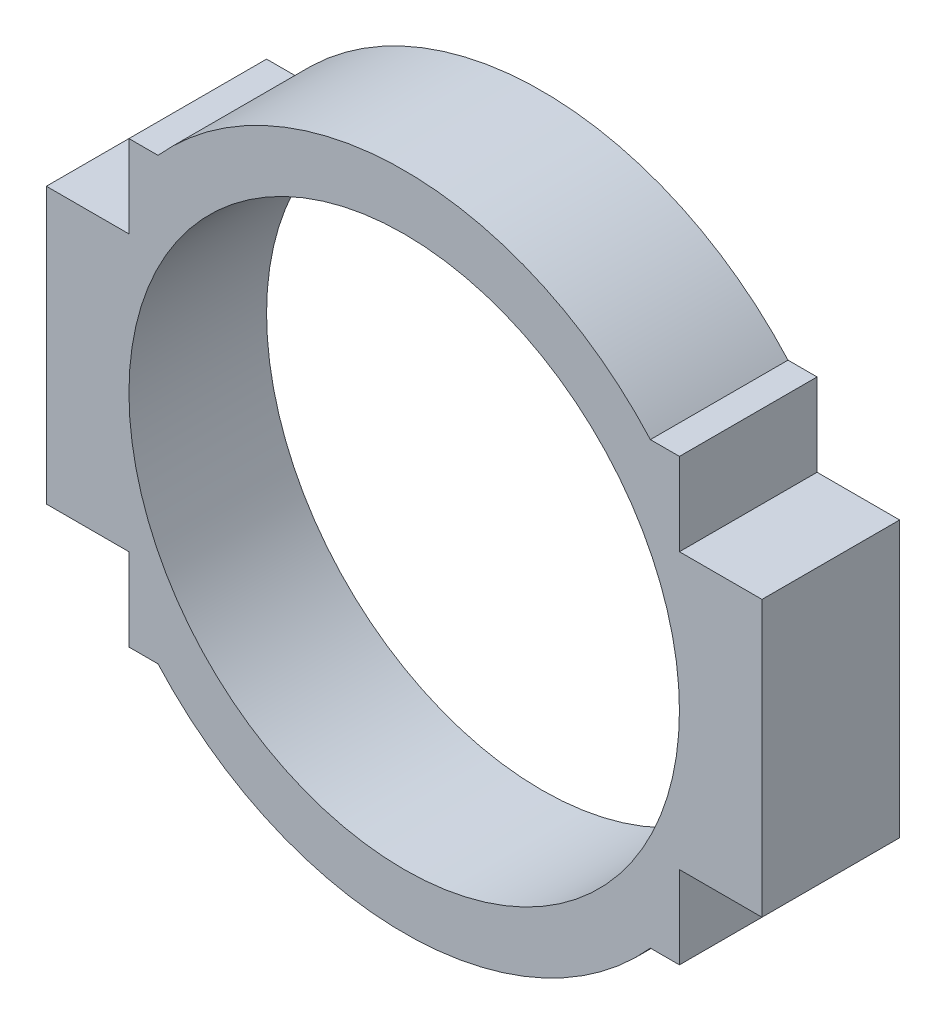
ISO-10303-21;
HEADER;
FILE_DESCRIPTION(('STEP AP214'),'2;1');
FILE_NAME('part.step','',(''),(''),'','','');
FILE_SCHEMA(('AUTOMOTIVE_DESIGN { 1 0 10303 214 1 1 1 1 }'));
ENDSEC;
DATA;
#1=APPLICATION_CONTEXT('core data for automotive mechanical design processes');
#2=APPLICATION_PROTOCOL_DEFINITION('international standard','automotive_design',2000,#1);
#3=PRODUCT_CONTEXT('',#1,'mechanical');
#4=PRODUCT('Part','Part','',(#3));
#5=PRODUCT_RELATED_PRODUCT_CATEGORY('part','',(#4));
#6=PRODUCT_DEFINITION_FORMATION('','',#4);
#7=PRODUCT_DEFINITION_CONTEXT('part definition',#1,'design');
#8=PRODUCT_DEFINITION('design','',#6,#7);
#9=PRODUCT_DEFINITION_SHAPE('','',#8);
#10=(LENGTH_UNIT() NAMED_UNIT(*) SI_UNIT(.MILLI.,.METRE.));
#11=(NAMED_UNIT(*) PLANE_ANGLE_UNIT() SI_UNIT($,.RADIAN.));
#12=(NAMED_UNIT(*) SI_UNIT($,.STERADIAN.) SOLID_ANGLE_UNIT());
#13=UNCERTAINTY_MEASURE_WITH_UNIT(LENGTH_MEASURE(1.E-05),#10,'distance_accuracy_value','');
#14=(GEOMETRIC_REPRESENTATION_CONTEXT(3) GLOBAL_UNCERTAINTY_ASSIGNED_CONTEXT((#13)) GLOBAL_UNIT_ASSIGNED_CONTEXT((#10,
#11,#12)) REPRESENTATION_CONTEXT('',''));
#15=CARTESIAN_POINT('',(0.,0.,0.));
#16=DIRECTION('',(0.,0.,1.));
#17=DIRECTION('',(1.,0.,0.));
#18=AXIS2_PLACEMENT_3D('',#15,#16,#17);
#19=CARTESIAN_POINT('',(0.,0.,5.));
#20=DIRECTION('',(0.,0.,1.));
#21=DIRECTION('',(1.,0.,0.));
#22=AXIS2_PLACEMENT_3D('',#19,#20,#21);
#23=PLANE('',#22);
#24=CARTESIAN_POINT('',(0.,0.,5.));
#25=DIRECTION('',(0.,0.,1.));
#26=DIRECTION('',(1.,0.,0.));
#27=AXIS2_PLACEMENT_3D('',#24,#25,#26);
#28=CIRCLE('',#27,12.);
#29=CARTESIAN_POINT('',(-8.94427190999916,-8.,5.));
#30=VERTEX_POINT('',#29);
#31=CARTESIAN_POINT('',(8.94427190999916,-8.,5.));
#32=VERTEX_POINT('',#31);
#33=EDGE_CURVE('E209',#30,#32,#28,.T.);
#34=ORIENTED_EDGE('',*,*,#33,.T.);
#35=DIRECTION('',(1.,0.,0.));
#36=VECTOR('',#35,1.);
#37=CARTESIAN_POINT('',(10.,-8.,5.));
#38=LINE('',#37,#36);
#39=CARTESIAN_POINT('',(10.,-8.,5.));
#40=VERTEX_POINT('',#39);
#41=EDGE_CURVE('E117',#32,#40,#38,.T.);
#42=ORIENTED_EDGE('',*,*,#41,.T.);
#43=DIRECTION('',(0.,1.,0.));
#44=VECTOR('',#43,1.);
#45=CARTESIAN_POINT('',(10.,-5.,5.));
#46=LINE('',#45,#44);
#47=CARTESIAN_POINT('',(10.,-5.,5.));
#48=VERTEX_POINT('',#47);
#49=EDGE_CURVE('E248',#40,#48,#46,.T.);
#50=ORIENTED_EDGE('',*,*,#49,.T.);
#51=DIRECTION('',(1.,0.,0.));
#52=VECTOR('',#51,1.);
#53=CARTESIAN_POINT('',(13.,-5.,5.));
#54=LINE('',#53,#52);
#55=CARTESIAN_POINT('',(13.,-5.,5.));
#56=VERTEX_POINT('',#55);
#57=EDGE_CURVE('E267',#48,#56,#54,.T.);
#58=ORIENTED_EDGE('',*,*,#57,.T.);
#59=DIRECTION('',(0.,1.,0.));
#60=VECTOR('',#59,1.);
#61=CARTESIAN_POINT('',(13.,-5.,5.));
#62=LINE('',#61,#60);
#63=CARTESIAN_POINT('',(13.,5.,5.));
#64=VERTEX_POINT('',#63);
#65=EDGE_CURVE('E264',#56,#64,#62,.T.);
#66=ORIENTED_EDGE('',*,*,#65,.T.);
#67=DIRECTION('',(-1.,0.,0.));
#68=VECTOR('',#67,1.);
#69=CARTESIAN_POINT('',(13.,5.,5.));
#70=LINE('',#69,#68);
#71=CARTESIAN_POINT('',(10.,5.,5.));
#72=VERTEX_POINT('',#71);
#73=EDGE_CURVE('E266',#64,#72,#70,.T.);
#74=ORIENTED_EDGE('',*,*,#73,.T.);
#75=DIRECTION('',(0.,1.,0.));
#76=VECTOR('',#75,1.);
#77=CARTESIAN_POINT('',(10.,5.,5.));
#78=LINE('',#77,#76);
#79=CARTESIAN_POINT('',(10.,8.,5.));
#80=VERTEX_POINT('',#79);
#81=EDGE_CURVE('E269',#72,#80,#78,.T.);
#82=ORIENTED_EDGE('',*,*,#81,.T.);
#83=DIRECTION('',(-1.,0.,0.));
#84=VECTOR('',#83,1.);
#85=CARTESIAN_POINT('',(10.,8.,5.));
#86=LINE('',#85,#84);
#87=CARTESIAN_POINT('',(8.94427190999916,8.,5.));
#88=VERTEX_POINT('',#87);
#89=EDGE_CURVE('E275',#80,#88,#86,.T.);
#90=ORIENTED_EDGE('',*,*,#89,.T.);
#91=CARTESIAN_POINT('',(0.,0.,5.));
#92=DIRECTION('',(0.,0.,1.));
#93=DIRECTION('',(-1.,0.,0.));
#94=AXIS2_PLACEMENT_3D('',#91,#92,#93);
#95=CIRCLE('',#94,12.);
#96=CARTESIAN_POINT('',(-8.94427190999916,8.,5.));
#97=VERTEX_POINT('',#96);
#98=EDGE_CURVE('E277',#88,#97,#95,.T.);
#99=ORIENTED_EDGE('',*,*,#98,.T.);
#100=DIRECTION('',(-1.,0.,0.));
#101=VECTOR('',#100,1.);
#102=CARTESIAN_POINT('',(-10.,8.,5.));
#103=LINE('',#102,#101);
#104=CARTESIAN_POINT('',(-10.,8.,5.));
#105=VERTEX_POINT('',#104);
#106=EDGE_CURVE('E279',#97,#105,#103,.T.);
#107=ORIENTED_EDGE('',*,*,#106,.T.);
#108=DIRECTION('',(0.,-1.,0.));
#109=VECTOR('',#108,1.);
#110=CARTESIAN_POINT('',(-10.,5.,5.));
#111=LINE('',#110,#109);
#112=CARTESIAN_POINT('',(-10.,5.,5.));
#113=VERTEX_POINT('',#112);
#114=EDGE_CURVE('E281',#105,#113,#111,.T.);
#115=ORIENTED_EDGE('',*,*,#114,.T.);
#116=DIRECTION('',(-1.,0.,0.));
#117=VECTOR('',#116,1.);
#118=CARTESIAN_POINT('',(-13.,5.,5.));
#119=LINE('',#118,#117);
#120=CARTESIAN_POINT('',(-13.,5.,5.));
#121=VERTEX_POINT('',#120);
#122=EDGE_CURVE('E283',#113,#121,#119,.T.);
#123=ORIENTED_EDGE('',*,*,#122,.T.);
#124=DIRECTION('',(0.,-1.,0.));
#125=VECTOR('',#124,1.);
#126=CARTESIAN_POINT('',(-13.,-5.,5.));
#127=LINE('',#126,#125);
#128=CARTESIAN_POINT('',(-13.,-5.,5.));
#129=VERTEX_POINT('',#128);
#130=EDGE_CURVE('E160',#121,#129,#127,.T.);
#131=ORIENTED_EDGE('',*,*,#130,.T.);
#132=DIRECTION('',(1.,0.,0.));
#133=VECTOR('',#132,1.);
#134=CARTESIAN_POINT('',(-13.,-5.,5.));
#135=LINE('',#134,#133);
#136=CARTESIAN_POINT('',(-10.,-5.,5.));
#137=VERTEX_POINT('',#136);
#138=EDGE_CURVE('E154',#129,#137,#135,.T.);
#139=ORIENTED_EDGE('',*,*,#138,.T.);
#140=DIRECTION('',(0.,-1.,0.));
#141=VECTOR('',#140,1.);
#142=CARTESIAN_POINT('',(-10.,-5.,5.));
#143=LINE('',#142,#141);
#144=CARTESIAN_POINT('',(-10.,-8.,5.));
#145=VERTEX_POINT('',#144);
#146=EDGE_CURVE('E158',#137,#145,#143,.T.);
#147=ORIENTED_EDGE('',*,*,#146,.T.);
#148=DIRECTION('',(1.,0.,0.));
#149=VECTOR('',#148,1.);
#150=CARTESIAN_POINT('',(-10.,-8.,5.));
#151=LINE('',#150,#149);
#152=EDGE_CURVE('E50',#145,#30,#151,.T.);
#153=ORIENTED_EDGE('',*,*,#152,.T.);
#154=EDGE_LOOP('',(#34,#42,#50,#58,#66,#74,#82,#90,#99,#107,#115,#123,#131,#139,#147,#153));
#155=FACE_BOUND('',#154,.T.);
#156=CARTESIAN_POINT('',(0.,0.,5.));
#157=DIRECTION('',(0.,0.,1.));
#158=DIRECTION('',(1.,0.,0.));
#159=AXIS2_PLACEMENT_3D('',#156,#157,#158);
#160=CIRCLE('',#159,10.);
#161=CARTESIAN_POINT('',(10.,0.,5.));
#162=VERTEX_POINT('',#161);
#163=EDGE_CURVE('E182',#162,#162,#160,.T.);
#164=ORIENTED_EDGE('',*,*,#163,.F.);
#165=EDGE_LOOP('',(#164));
#166=FACE_BOUND('',#165,.T.);
#167=ADVANCED_FACE('F33',(#155,#166),#23,.T.);
#168=CARTESIAN_POINT('',(0.,0.,0.));
#169=DIRECTION('',(0.,0.,1.));
#170=DIRECTION('',(1.,0.,0.));
#171=AXIS2_PLACEMENT_3D('',#168,#169,#170);
#172=PLANE('',#171);
#173=CARTESIAN_POINT('',(0.,0.,0.));
#174=DIRECTION('',(0.,0.,1.));
#175=DIRECTION('',(1.,0.,0.));
#176=AXIS2_PLACEMENT_3D('',#173,#174,#175);
#177=CIRCLE('',#176,12.);
#178=CARTESIAN_POINT('',(-8.94427190999916,-8.,0.));
#179=VERTEX_POINT('',#178);
#180=CARTESIAN_POINT('',(8.94427190999916,-8.,0.));
#181=VERTEX_POINT('',#180);
#182=EDGE_CURVE('E178',#179,#181,#177,.T.);
#183=ORIENTED_EDGE('',*,*,#182,.F.);
#184=DIRECTION('',(1.,0.,0.));
#185=VECTOR('',#184,1.);
#186=CARTESIAN_POINT('',(-10.,-8.,0.));
#187=LINE('',#186,#185);
#188=CARTESIAN_POINT('',(-10.,-8.,0.));
#189=VERTEX_POINT('',#188);
#190=EDGE_CURVE('E109',#189,#179,#187,.T.);
#191=ORIENTED_EDGE('',*,*,#190,.F.);
#192=DIRECTION('',(0.,-1.,0.));
#193=VECTOR('',#192,1.);
#194=CARTESIAN_POINT('',(-10.,-5.,0.));
#195=LINE('',#194,#193);
#196=CARTESIAN_POINT('',(-10.,-5.,0.));
#197=VERTEX_POINT('',#196);
#198=EDGE_CURVE('E103',#197,#189,#195,.T.);
#199=ORIENTED_EDGE('',*,*,#198,.F.);
#200=DIRECTION('',(1.,0.,0.));
#201=VECTOR('',#200,1.);
#202=CARTESIAN_POINT('',(-13.,-5.,0.));
#203=LINE('',#202,#201);
#204=CARTESIAN_POINT('',(-13.,-5.,0.));
#205=VERTEX_POINT('',#204);
#206=EDGE_CURVE('E168',#205,#197,#203,.T.);
#207=ORIENTED_EDGE('',*,*,#206,.F.);
#208=DIRECTION('',(0.,-1.,0.));
#209=VECTOR('',#208,1.);
#210=CARTESIAN_POINT('',(-13.,-5.,0.));
#211=LINE('',#210,#209);
#212=CARTESIAN_POINT('',(-13.,5.,0.));
#213=VERTEX_POINT('',#212);
#214=EDGE_CURVE('E204',#213,#205,#211,.T.);
#215=ORIENTED_EDGE('',*,*,#214,.F.);
#216=DIRECTION('',(-1.,0.,0.));
#217=VECTOR('',#216,1.);
#218=CARTESIAN_POINT('',(-13.,5.,0.));
#219=LINE('',#218,#217);
#220=CARTESIAN_POINT('',(-10.,5.,0.));
#221=VERTEX_POINT('',#220);
#222=EDGE_CURVE('E202',#221,#213,#219,.T.);
#223=ORIENTED_EDGE('',*,*,#222,.F.);
#224=DIRECTION('',(0.,-1.,0.));
#225=VECTOR('',#224,1.);
#226=CARTESIAN_POINT('',(-10.,5.,0.));
#227=LINE('',#226,#225);
#228=CARTESIAN_POINT('',(-10.,8.,0.));
#229=VERTEX_POINT('',#228);
#230=EDGE_CURVE('E200',#229,#221,#227,.T.);
#231=ORIENTED_EDGE('',*,*,#230,.F.);
#232=DIRECTION('',(-1.,0.,0.));
#233=VECTOR('',#232,1.);
#234=CARTESIAN_POINT('',(-10.,8.,0.));
#235=LINE('',#234,#233);
#236=CARTESIAN_POINT('',(-8.94427190999916,8.,0.));
#237=VERTEX_POINT('',#236);
#238=EDGE_CURVE('E198',#237,#229,#235,.T.);
#239=ORIENTED_EDGE('',*,*,#238,.F.);
#240=CARTESIAN_POINT('',(0.,0.,0.));
#241=DIRECTION('',(0.,0.,1.));
#242=DIRECTION('',(-1.,0.,0.));
#243=AXIS2_PLACEMENT_3D('',#240,#241,#242);
#244=CIRCLE('',#243,12.);
#245=CARTESIAN_POINT('',(8.94427190999916,8.,0.));
#246=VERTEX_POINT('',#245);
#247=EDGE_CURVE('E196',#246,#237,#244,.T.);
#248=ORIENTED_EDGE('',*,*,#247,.F.);
#249=DIRECTION('',(-1.,0.,0.));
#250=VECTOR('',#249,1.);
#251=CARTESIAN_POINT('',(10.,8.,0.));
#252=LINE('',#251,#250);
#253=CARTESIAN_POINT('',(10.,8.,0.));
#254=VERTEX_POINT('',#253);
#255=EDGE_CURVE('E194',#254,#246,#252,.T.);
#256=ORIENTED_EDGE('',*,*,#255,.F.);
#257=DIRECTION('',(0.,1.,0.));
#258=VECTOR('',#257,1.);
#259=CARTESIAN_POINT('',(10.,5.,0.));
#260=LINE('',#259,#258);
#261=CARTESIAN_POINT('',(10.,5.,0.));
#262=VERTEX_POINT('',#261);
#263=EDGE_CURVE('E192',#262,#254,#260,.T.);
#264=ORIENTED_EDGE('',*,*,#263,.F.);
#265=DIRECTION('',(-1.,0.,0.));
#266=VECTOR('',#265,1.);
#267=CARTESIAN_POINT('',(13.,5.,0.));
#268=LINE('',#267,#266);
#269=CARTESIAN_POINT('',(13.,5.,0.));
#270=VERTEX_POINT('',#269);
#271=EDGE_CURVE('E190',#270,#262,#268,.T.);
#272=ORIENTED_EDGE('',*,*,#271,.F.);
#273=DIRECTION('',(0.,1.,0.));
#274=VECTOR('',#273,1.);
#275=CARTESIAN_POINT('',(13.,-5.,0.));
#276=LINE('',#275,#274);
#277=CARTESIAN_POINT('',(13.,-5.,0.));
#278=VERTEX_POINT('',#277);
#279=EDGE_CURVE('E188',#278,#270,#276,.T.);
#280=ORIENTED_EDGE('',*,*,#279,.F.);
#281=DIRECTION('',(1.,0.,0.));
#282=VECTOR('',#281,1.);
#283=CARTESIAN_POINT('',(13.,-5.,0.));
#284=LINE('',#283,#282);
#285=CARTESIAN_POINT('',(10.,-5.,0.));
#286=VERTEX_POINT('',#285);
#287=EDGE_CURVE('E186',#286,#278,#284,.T.);
#288=ORIENTED_EDGE('',*,*,#287,.F.);
#289=DIRECTION('',(0.,1.,0.));
#290=VECTOR('',#289,1.);
#291=CARTESIAN_POINT('',(10.,-5.,0.));
#292=LINE('',#291,#290);
#293=CARTESIAN_POINT('',(10.,-8.,0.));
#294=VERTEX_POINT('',#293);
#295=EDGE_CURVE('E184',#294,#286,#292,.T.);
#296=ORIENTED_EDGE('',*,*,#295,.F.);
#297=DIRECTION('',(1.,0.,0.));
#298=VECTOR('',#297,1.);
#299=CARTESIAN_POINT('',(10.,-8.,0.));
#300=LINE('',#299,#298);
#301=EDGE_CURVE('E181',#181,#294,#300,.T.);
#302=ORIENTED_EDGE('',*,*,#301,.F.);
#303=EDGE_LOOP('',(#183,#191,#199,#207,#215,#223,#231,#239,#248,#256,#264,#272,#280,#288,#296,#302));
#304=FACE_BOUND('',#303,.T.);
#305=CARTESIAN_POINT('',(0.,0.,0.));
#306=DIRECTION('',(0.,0.,1.));
#307=DIRECTION('',(1.,0.,0.));
#308=AXIS2_PLACEMENT_3D('',#305,#306,#307);
#309=CIRCLE('',#308,10.);
#310=CARTESIAN_POINT('',(10.,0.,0.));
#311=VERTEX_POINT('',#310);
#312=EDGE_CURVE('E482',#311,#311,#309,.T.);
#313=ORIENTED_EDGE('',*,*,#312,.T.);
#314=EDGE_LOOP('',(#313));
#315=FACE_BOUND('',#314,.T.);
#316=ADVANCED_FACE('F252',(#304,#315),#172,.F.);
#317=CARTESIAN_POINT('',(0.,0.,5.));
#318=DIRECTION('',(0.,0.,-1.));
#319=DIRECTION('',(-1.,0.,0.));
#320=AXIS2_PLACEMENT_3D('',#317,#318,#319);
#321=CYLINDRICAL_SURFACE('',#320,12.);
#322=ORIENTED_EDGE('',*,*,#182,.T.);
#323=DIRECTION('',(0.,0.,-1.));
#324=VECTOR('',#323,1.);
#325=CARTESIAN_POINT('',(8.94427190999916,-8.,5.));
#326=LINE('',#325,#324);
#327=EDGE_CURVE('E11',#32,#181,#326,.T.);
#328=ORIENTED_EDGE('',*,*,#327,.F.);
#329=ORIENTED_EDGE('',*,*,#33,.F.);
#330=DIRECTION('',(0.,0.,-1.));
#331=VECTOR('',#330,1.);
#332=CARTESIAN_POINT('',(-8.94427190999916,-8.,5.));
#333=LINE('',#332,#331);
#334=EDGE_CURVE('E174',#30,#179,#333,.T.);
#335=ORIENTED_EDGE('',*,*,#334,.T.);
#336=EDGE_LOOP('',(#322,#328,#329,#335));
#337=FACE_BOUND('',#336,.T.);
#338=ADVANCED_FACE('F35',(#337),#321,.T.);
#339=CARTESIAN_POINT('',(10.,-8.,5.));
#340=DIRECTION('',(0.,1.,0.));
#341=DIRECTION('',(0.,0.,1.));
#342=AXIS2_PLACEMENT_3D('',#339,#340,#341);
#343=PLANE('',#342);
#344=ORIENTED_EDGE('',*,*,#301,.T.);
#345=DIRECTION('',(0.,0.,-1.));
#346=VECTOR('',#345,1.);
#347=CARTESIAN_POINT('',(10.,-8.,5.));
#348=LINE('',#347,#346);
#349=EDGE_CURVE('E42',#40,#294,#348,.T.);
#350=ORIENTED_EDGE('',*,*,#349,.F.);
#351=ORIENTED_EDGE('',*,*,#41,.F.);
#352=ORIENTED_EDGE('',*,*,#327,.T.);
#353=EDGE_LOOP('',(#344,#350,#351,#352));
#354=FACE_BOUND('',#353,.T.);
#355=ADVANCED_FACE('F317',(#354),#343,.F.);
#356=CARTESIAN_POINT('',(10.,-5.,5.));
#357=DIRECTION('',(-1.,0.,0.));
#358=DIRECTION('',(0.,0.,1.));
#359=AXIS2_PLACEMENT_3D('',#356,#357,#358);
#360=PLANE('',#359);
#361=ORIENTED_EDGE('',*,*,#295,.T.);
#362=DIRECTION('',(0.,0.,-1.));
#363=VECTOR('',#362,1.);
#364=CARTESIAN_POINT('',(10.,-5.,5.));
#365=LINE('',#364,#363);
#366=EDGE_CURVE('E240',#48,#286,#365,.T.);
#367=ORIENTED_EDGE('',*,*,#366,.F.);
#368=ORIENTED_EDGE('',*,*,#49,.F.);
#369=ORIENTED_EDGE('',*,*,#349,.T.);
#370=EDGE_LOOP('',(#361,#367,#368,#369));
#371=FACE_BOUND('',#370,.T.);
#372=ADVANCED_FACE('F246',(#371),#360,.F.);
#373=CARTESIAN_POINT('',(13.,-5.,5.));
#374=DIRECTION('',(0.,1.,0.));
#375=DIRECTION('',(0.,0.,1.));
#376=AXIS2_PLACEMENT_3D('',#373,#374,#375);
#377=PLANE('',#376);
#378=ORIENTED_EDGE('',*,*,#287,.T.);
#379=DIRECTION('',(0.,0.,-1.));
#380=VECTOR('',#379,1.);
#381=CARTESIAN_POINT('',(13.,-5.,5.));
#382=LINE('',#381,#380);
#383=EDGE_CURVE('E237',#56,#278,#382,.T.);
#384=ORIENTED_EDGE('',*,*,#383,.F.);
#385=ORIENTED_EDGE('',*,*,#57,.F.);
#386=ORIENTED_EDGE('',*,*,#366,.T.);
#387=EDGE_LOOP('',(#378,#384,#385,#386));
#388=FACE_BOUND('',#387,.T.);
#389=ADVANCED_FACE('F258',(#388),#377,.F.);
#390=CARTESIAN_POINT('',(13.,-5.,5.));
#391=DIRECTION('',(-1.,0.,0.));
#392=DIRECTION('',(0.,0.,1.));
#393=AXIS2_PLACEMENT_3D('',#390,#391,#392);
#394=PLANE('',#393);
#395=ORIENTED_EDGE('',*,*,#279,.T.);
#396=DIRECTION('',(0.,0.,-1.));
#397=VECTOR('',#396,1.);
#398=CARTESIAN_POINT('',(13.,5.,5.));
#399=LINE('',#398,#397);
#400=EDGE_CURVE('E234',#64,#270,#399,.T.);
#401=ORIENTED_EDGE('',*,*,#400,.F.);
#402=ORIENTED_EDGE('',*,*,#65,.F.);
#403=ORIENTED_EDGE('',*,*,#383,.T.);
#404=EDGE_LOOP('',(#395,#401,#402,#403));
#405=FACE_BOUND('',#404,.T.);
#406=ADVANCED_FACE('F262',(#405),#394,.F.);
#407=CARTESIAN_POINT('',(13.,5.,5.));
#408=DIRECTION('',(0.,-1.,0.));
#409=DIRECTION('',(0.,0.,-1.));
#410=AXIS2_PLACEMENT_3D('',#407,#408,#409);
#411=PLANE('',#410);
#412=ORIENTED_EDGE('',*,*,#271,.T.);
#413=DIRECTION('',(0.,0.,-1.));
#414=VECTOR('',#413,1.);
#415=CARTESIAN_POINT('',(10.,5.,5.));
#416=LINE('',#415,#414);
#417=EDGE_CURVE('E231',#72,#262,#416,.T.);
#418=ORIENTED_EDGE('',*,*,#417,.F.);
#419=ORIENTED_EDGE('',*,*,#73,.F.);
#420=ORIENTED_EDGE('',*,*,#400,.T.);
#421=EDGE_LOOP('',(#412,#418,#419,#420));
#422=FACE_BOUND('',#421,.T.);
#423=ADVANCED_FACE('F330',(#422),#411,.F.);
#424=CARTESIAN_POINT('',(10.,5.,5.));
#425=DIRECTION('',(-1.,0.,0.));
#426=DIRECTION('',(0.,0.,1.));
#427=AXIS2_PLACEMENT_3D('',#424,#425,#426);
#428=PLANE('',#427);
#429=ORIENTED_EDGE('',*,*,#263,.T.);
#430=DIRECTION('',(0.,0.,-1.));
#431=VECTOR('',#430,1.);
#432=CARTESIAN_POINT('',(10.,8.,5.));
#433=LINE('',#432,#431);
#434=EDGE_CURVE('E228',#80,#254,#433,.T.);
#435=ORIENTED_EDGE('',*,*,#434,.F.);
#436=ORIENTED_EDGE('',*,*,#81,.F.);
#437=ORIENTED_EDGE('',*,*,#417,.T.);
#438=EDGE_LOOP('',(#429,#435,#436,#437));
#439=FACE_BOUND('',#438,.T.);
#440=ADVANCED_FACE('F333',(#439),#428,.F.);
#441=CARTESIAN_POINT('',(10.,8.,5.));
#442=DIRECTION('',(0.,-1.,0.));
#443=DIRECTION('',(0.,0.,-1.));
#444=AXIS2_PLACEMENT_3D('',#441,#442,#443);
#445=PLANE('',#444);
#446=ORIENTED_EDGE('',*,*,#255,.T.);
#447=DIRECTION('',(0.,0.,-1.));
#448=VECTOR('',#447,1.);
#449=CARTESIAN_POINT('',(8.94427190999916,8.,5.));
#450=LINE('',#449,#448);
#451=EDGE_CURVE('E225',#88,#246,#450,.T.);
#452=ORIENTED_EDGE('',*,*,#451,.F.);
#453=ORIENTED_EDGE('',*,*,#89,.F.);
#454=ORIENTED_EDGE('',*,*,#434,.T.);
#455=EDGE_LOOP('',(#446,#452,#453,#454));
#456=FACE_BOUND('',#455,.T.);
#457=ADVANCED_FACE('F337',(#456),#445,.F.);
#458=CARTESIAN_POINT('',(0.,0.,5.));
#459=DIRECTION('',(0.,0.,-1.));
#460=DIRECTION('',(-1.,0.,0.));
#461=AXIS2_PLACEMENT_3D('',#458,#459,#460);
#462=CYLINDRICAL_SURFACE('',#461,12.);
#463=ORIENTED_EDGE('',*,*,#247,.T.);
#464=DIRECTION('',(0.,0.,-1.));
#465=VECTOR('',#464,1.);
#466=CARTESIAN_POINT('',(-8.94427190999916,8.,5.));
#467=LINE('',#466,#465);
#468=EDGE_CURVE('E222',#97,#237,#467,.T.);
#469=ORIENTED_EDGE('',*,*,#468,.F.);
#470=ORIENTED_EDGE('',*,*,#98,.F.);
#471=ORIENTED_EDGE('',*,*,#451,.T.);
#472=EDGE_LOOP('',(#463,#469,#470,#471));
#473=FACE_BOUND('',#472,.T.);
#474=ADVANCED_FACE('F341',(#473),#462,.T.);
#475=CARTESIAN_POINT('',(-10.,8.,5.));
#476=DIRECTION('',(0.,-1.,0.));
#477=DIRECTION('',(0.,0.,-1.));
#478=AXIS2_PLACEMENT_3D('',#475,#476,#477);
#479=PLANE('',#478);
#480=ORIENTED_EDGE('',*,*,#238,.T.);
#481=DIRECTION('',(0.,0.,-1.));
#482=VECTOR('',#481,1.);
#483=CARTESIAN_POINT('',(-10.,8.,5.));
#484=LINE('',#483,#482);
#485=EDGE_CURVE('E219',#105,#229,#484,.T.);
#486=ORIENTED_EDGE('',*,*,#485,.F.);
#487=ORIENTED_EDGE('',*,*,#106,.F.);
#488=ORIENTED_EDGE('',*,*,#468,.T.);
#489=EDGE_LOOP('',(#480,#486,#487,#488));
#490=FACE_BOUND('',#489,.T.);
#491=ADVANCED_FACE('F345',(#490),#479,.F.);
#492=CARTESIAN_POINT('',(-10.,5.,5.));
#493=DIRECTION('',(1.,0.,0.));
#494=DIRECTION('',(0.,0.,-1.));
#495=AXIS2_PLACEMENT_3D('',#492,#493,#494);
#496=PLANE('',#495);
#497=ORIENTED_EDGE('',*,*,#230,.T.);
#498=DIRECTION('',(0.,0.,-1.));
#499=VECTOR('',#498,1.);
#500=CARTESIAN_POINT('',(-10.,5.,5.));
#501=LINE('',#500,#499);
#502=EDGE_CURVE('E216',#113,#221,#501,.T.);
#503=ORIENTED_EDGE('',*,*,#502,.F.);
#504=ORIENTED_EDGE('',*,*,#114,.F.);
#505=ORIENTED_EDGE('',*,*,#485,.T.);
#506=EDGE_LOOP('',(#497,#503,#504,#505));
#507=FACE_BOUND('',#506,.T.);
#508=ADVANCED_FACE('F349',(#507),#496,.F.);
#509=CARTESIAN_POINT('',(-13.,5.,5.));
#510=DIRECTION('',(0.,-1.,0.));
#511=DIRECTION('',(0.,0.,-1.));
#512=AXIS2_PLACEMENT_3D('',#509,#510,#511);
#513=PLANE('',#512);
#514=ORIENTED_EDGE('',*,*,#222,.T.);
#515=DIRECTION('',(0.,0.,-1.));
#516=VECTOR('',#515,1.);
#517=CARTESIAN_POINT('',(-13.,5.,5.));
#518=LINE('',#517,#516);
#519=EDGE_CURVE('E213',#121,#213,#518,.T.);
#520=ORIENTED_EDGE('',*,*,#519,.F.);
#521=ORIENTED_EDGE('',*,*,#122,.F.);
#522=ORIENTED_EDGE('',*,*,#502,.T.);
#523=EDGE_LOOP('',(#514,#520,#521,#522));
#524=FACE_BOUND('',#523,.T.);
#525=ADVANCED_FACE('F289',(#524),#513,.F.);
#526=CARTESIAN_POINT('',(-13.,-5.,5.));
#527=DIRECTION('',(1.,0.,0.));
#528=DIRECTION('',(0.,0.,-1.));
#529=AXIS2_PLACEMENT_3D('',#526,#527,#528);
#530=PLANE('',#529);
#531=ORIENTED_EDGE('',*,*,#214,.T.);
#532=DIRECTION('',(0.,0.,-1.));
#533=VECTOR('',#532,1.);
#534=CARTESIAN_POINT('',(-13.,-5.,5.));
#535=LINE('',#534,#533);
#536=EDGE_CURVE('E169',#129,#205,#535,.T.);
#537=ORIENTED_EDGE('',*,*,#536,.F.);
#538=ORIENTED_EDGE('',*,*,#130,.F.);
#539=ORIENTED_EDGE('',*,*,#519,.T.);
#540=EDGE_LOOP('',(#531,#537,#538,#539));
#541=FACE_BOUND('',#540,.T.);
#542=ADVANCED_FACE('F293',(#541),#530,.F.);
#543=CARTESIAN_POINT('',(-13.,-5.,5.));
#544=DIRECTION('',(0.,1.,0.));
#545=DIRECTION('',(0.,0.,1.));
#546=AXIS2_PLACEMENT_3D('',#543,#544,#545);
#547=PLANE('',#546);
#548=ORIENTED_EDGE('',*,*,#206,.T.);
#549=DIRECTION('',(0.,0.,-1.));
#550=VECTOR('',#549,1.);
#551=CARTESIAN_POINT('',(-10.,-5.,5.));
#552=LINE('',#551,#550);
#553=EDGE_CURVE('E165',#137,#197,#552,.T.);
#554=ORIENTED_EDGE('',*,*,#553,.F.);
#555=ORIENTED_EDGE('',*,*,#138,.F.);
#556=ORIENTED_EDGE('',*,*,#536,.T.);
#557=EDGE_LOOP('',(#548,#554,#555,#556));
#558=FACE_BOUND('',#557,.T.);
#559=ADVANCED_FACE('F166',(#558),#547,.F.);
#560=CARTESIAN_POINT('',(-10.,-5.,5.));
#561=DIRECTION('',(1.,0.,0.));
#562=DIRECTION('',(0.,0.,-1.));
#563=AXIS2_PLACEMENT_3D('',#560,#561,#562);
#564=PLANE('',#563);
#565=ORIENTED_EDGE('',*,*,#198,.T.);
#566=DIRECTION('',(0.,0.,-1.));
#567=VECTOR('',#566,1.);
#568=CARTESIAN_POINT('',(-10.,-8.,5.));
#569=LINE('',#568,#567);
#570=EDGE_CURVE('E170',#145,#189,#569,.T.);
#571=ORIENTED_EDGE('',*,*,#570,.F.);
#572=ORIENTED_EDGE('',*,*,#146,.F.);
#573=ORIENTED_EDGE('',*,*,#553,.T.);
#574=EDGE_LOOP('',(#565,#571,#572,#573));
#575=FACE_BOUND('',#574,.T.);
#576=ADVANCED_FACE('F172',(#575),#564,.F.);
#577=CARTESIAN_POINT('',(-10.,-8.,5.));
#578=DIRECTION('',(0.,1.,0.));
#579=DIRECTION('',(0.,0.,1.));
#580=AXIS2_PLACEMENT_3D('',#577,#578,#579);
#581=PLANE('',#580);
#582=ORIENTED_EDGE('',*,*,#190,.T.);
#583=ORIENTED_EDGE('',*,*,#334,.F.);
#584=ORIENTED_EDGE('',*,*,#152,.F.);
#585=ORIENTED_EDGE('',*,*,#570,.T.);
#586=EDGE_LOOP('',(#582,#583,#584,#585));
#587=FACE_BOUND('',#586,.T.);
#588=ADVANCED_FACE('F297',(#587),#581,.F.);
#589=CARTESIAN_POINT('',(0.,0.,5.));
#590=DIRECTION('',(0.,0.,-1.));
#591=DIRECTION('',(-1.,0.,0.));
#592=AXIS2_PLACEMENT_3D('',#589,#590,#591);
#593=CYLINDRICAL_SURFACE('',#592,10.);
#594=ORIENTED_EDGE('',*,*,#163,.T.);
#595=EDGE_LOOP('',(#594));
#596=FACE_BOUND('',#595,.T.);
#597=ORIENTED_EDGE('',*,*,#312,.F.);
#598=EDGE_LOOP('',(#597));
#599=FACE_BOUND('',#598,.T.);
#600=ADVANCED_FACE('F299',(#596,#599),#593,.F.);
#601=CLOSED_SHELL('',(#167,#316,#338,#355,#372,#389,#406,#423,#440,#457,#474,#491,#508,#525,
#542,#559,#576,#588,#600));
#602=MANIFOLD_SOLID_BREP('B2',#601);
#603=ADVANCED_BREP_SHAPE_REPRESENTATION('',(#18,#602),#14);
#604=SHAPE_DEFINITION_REPRESENTATION(#9,#603);
ENDSEC;
END-ISO-10303-21;
